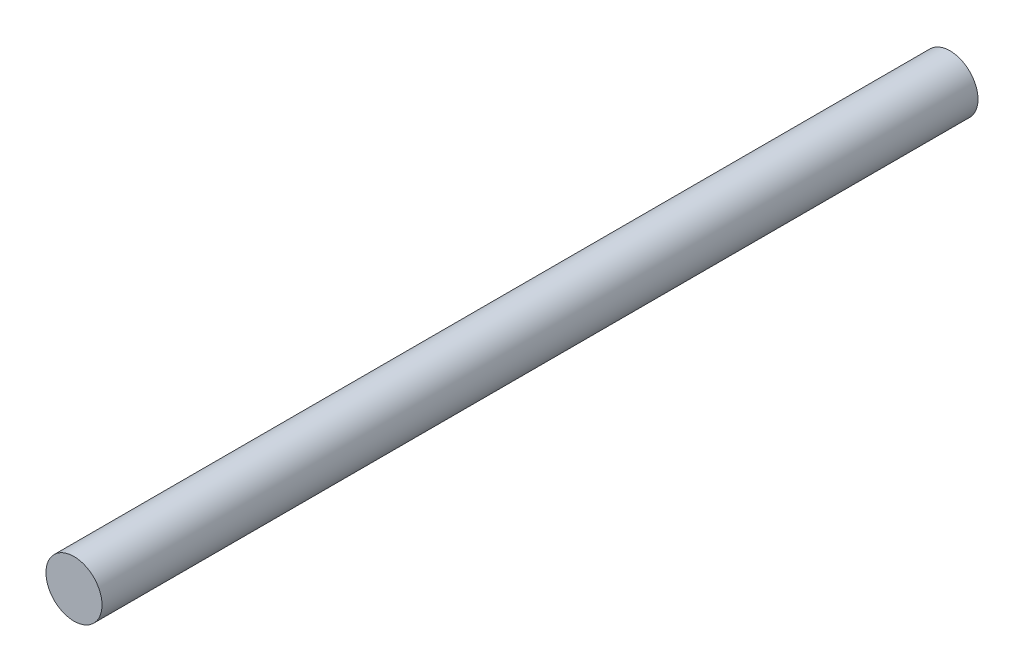
ISO-10303-21;
HEADER;
FILE_DESCRIPTION(('STEP AP214'),'2;1');
FILE_NAME('part.step','',(''),(''),'','','');
FILE_SCHEMA(('AUTOMOTIVE_DESIGN { 1 0 10303 214 1 1 1 1 }'));
ENDSEC;
DATA;
#1=APPLICATION_CONTEXT('core data for automotive mechanical design processes');
#2=APPLICATION_PROTOCOL_DEFINITION('international standard','automotive_design',2000,#1);
#3=PRODUCT_CONTEXT('',#1,'mechanical');
#4=PRODUCT('Part','Part','',(#3));
#5=PRODUCT_RELATED_PRODUCT_CATEGORY('part','',(#4));
#6=PRODUCT_DEFINITION_FORMATION('','',#4);
#7=PRODUCT_DEFINITION_CONTEXT('part definition',#1,'design');
#8=PRODUCT_DEFINITION('design','',#6,#7);
#9=PRODUCT_DEFINITION_SHAPE('','',#8);
#10=(LENGTH_UNIT() NAMED_UNIT(*) SI_UNIT(.MILLI.,.METRE.));
#11=(NAMED_UNIT(*) PLANE_ANGLE_UNIT() SI_UNIT($,.RADIAN.));
#12=(NAMED_UNIT(*) SI_UNIT($,.STERADIAN.) SOLID_ANGLE_UNIT());
#13=UNCERTAINTY_MEASURE_WITH_UNIT(LENGTH_MEASURE(1.E-05),#10,'distance_accuracy_value','');
#14=(GEOMETRIC_REPRESENTATION_CONTEXT(3) GLOBAL_UNCERTAINTY_ASSIGNED_CONTEXT((#13)) GLOBAL_UNIT_ASSIGNED_CONTEXT((#10,
#11,#12)) REPRESENTATION_CONTEXT('',''));
#15=CARTESIAN_POINT('',(0.,0.,0.));
#16=DIRECTION('',(0.,0.,1.));
#17=DIRECTION('',(1.,0.,0.));
#18=AXIS2_PLACEMENT_3D('',#15,#16,#17);
#19=CARTESIAN_POINT('',(0.,0.,50.));
#20=DIRECTION('',(0.,0.,-1.));
#21=DIRECTION('',(-1.,0.,0.));
#22=AXIS2_PLACEMENT_3D('',#19,#20,#21);
#23=CYLINDRICAL_SURFACE('',#22,1.6);
#24=CARTESIAN_POINT('',(0.,0.,50.));
#25=DIRECTION('',(0.,0.,1.));
#26=DIRECTION('',(1.,0.,0.));
#27=AXIS2_PLACEMENT_3D('',#24,#25,#26);
#28=CIRCLE('',#27,1.6);
#29=CARTESIAN_POINT('',(1.6,0.,50.));
#30=VERTEX_POINT('',#29);
#31=EDGE_CURVE('E10',#30,#30,#28,.T.);
#32=ORIENTED_EDGE('',*,*,#31,.F.);
#33=EDGE_LOOP('',(#32));
#34=FACE_BOUND('',#33,.T.);
#35=CARTESIAN_POINT('',(0.,0.,0.));
#36=DIRECTION('',(0.,0.,1.));
#37=DIRECTION('',(1.,0.,0.));
#38=AXIS2_PLACEMENT_3D('',#35,#36,#37);
#39=CIRCLE('',#38,1.6);
#40=CARTESIAN_POINT('',(1.6,0.,0.));
#41=VERTEX_POINT('',#40);
#42=EDGE_CURVE('E38',#41,#41,#39,.T.);
#43=ORIENTED_EDGE('',*,*,#42,.T.);
#44=EDGE_LOOP('',(#43));
#45=FACE_BOUND('',#44,.T.);
#46=ADVANCED_FACE('F35',(#34,#45),#23,.T.);
#47=CARTESIAN_POINT('',(0.,0.,50.));
#48=DIRECTION('',(0.,0.,1.));
#49=DIRECTION('',(1.,0.,0.));
#50=AXIS2_PLACEMENT_3D('',#47,#48,#49);
#51=PLANE('',#50);
#52=ORIENTED_EDGE('',*,*,#31,.T.);
#53=EDGE_LOOP('',(#52));
#54=FACE_BOUND('',#53,.T.);
#55=ADVANCED_FACE('F50',(#54),#51,.T.);
#56=CARTESIAN_POINT('',(0.,0.,0.));
#57=DIRECTION('',(0.,0.,1.));
#58=DIRECTION('',(1.,0.,0.));
#59=AXIS2_PLACEMENT_3D('',#56,#57,#58);
#60=PLANE('',#59);
#61=ORIENTED_EDGE('',*,*,#42,.F.);
#62=EDGE_LOOP('',(#61));
#63=FACE_BOUND('',#62,.T.);
#64=ADVANCED_FACE('F48',(#63),#60,.F.);
#65=CLOSED_SHELL('',(#46,#55,#64));
#66=MANIFOLD_SOLID_BREP('B2',#65);
#67=ADVANCED_BREP_SHAPE_REPRESENTATION('',(#18,#66),#14);
#68=SHAPE_DEFINITION_REPRESENTATION(#9,#67);
ENDSEC;
END-ISO-10303-21;
